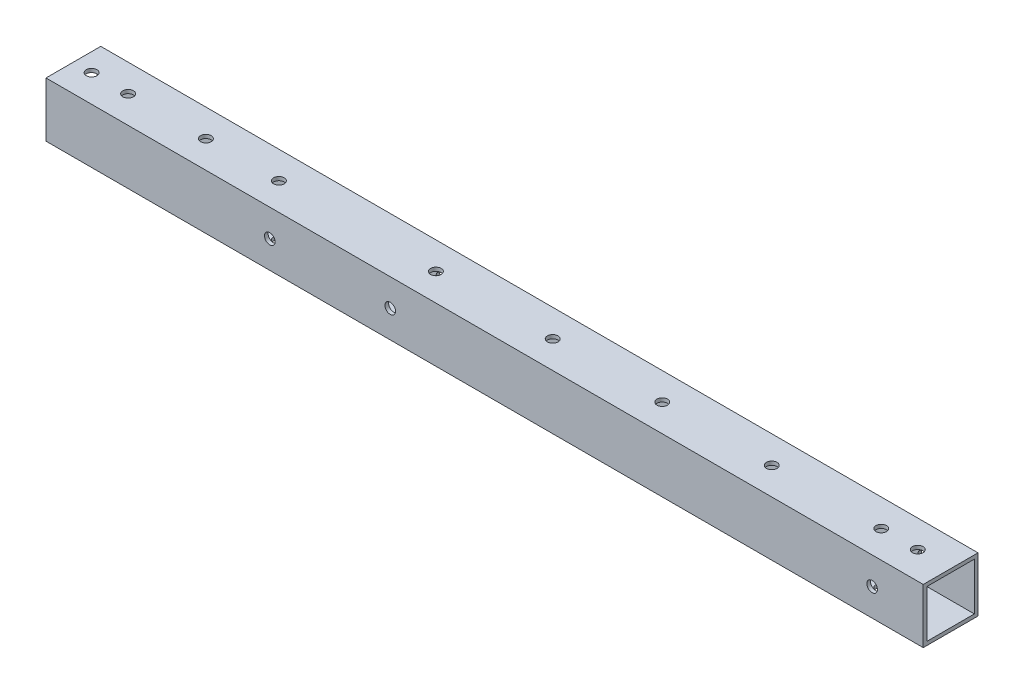
ISO-10303-21;
HEADER;
FILE_DESCRIPTION(('STEP AP214'),'2;1');
FILE_NAME('part.step','',(''),(''),'','','');
FILE_SCHEMA(('AUTOMOTIVE_DESIGN { 1 0 10303 214 1 1 1 1 }'));
ENDSEC;
DATA;
#1=APPLICATION_CONTEXT('core data for automotive mechanical design processes');
#2=APPLICATION_PROTOCOL_DEFINITION('international standard','automotive_design',2000,#1);
#3=PRODUCT_CONTEXT('',#1,'mechanical');
#4=PRODUCT('Part','Part','',(#3));
#5=PRODUCT_RELATED_PRODUCT_CATEGORY('part','',(#4));
#6=PRODUCT_DEFINITION_FORMATION('','',#4);
#7=PRODUCT_DEFINITION_CONTEXT('part definition',#1,'design');
#8=PRODUCT_DEFINITION('design','',#6,#7);
#9=PRODUCT_DEFINITION_SHAPE('','',#8);
#10=(LENGTH_UNIT() NAMED_UNIT(*) SI_UNIT(.MILLI.,.METRE.));
#11=(NAMED_UNIT(*) PLANE_ANGLE_UNIT() SI_UNIT($,.RADIAN.));
#12=(NAMED_UNIT(*) SI_UNIT($,.STERADIAN.) SOLID_ANGLE_UNIT());
#13=UNCERTAINTY_MEASURE_WITH_UNIT(LENGTH_MEASURE(1.E-05),#10,'distance_accuracy_value','');
#14=(GEOMETRIC_REPRESENTATION_CONTEXT(3) GLOBAL_UNCERTAINTY_ASSIGNED_CONTEXT((#13)) GLOBAL_UNIT_ASSIGNED_CONTEXT((#10,
#11,#12)) REPRESENTATION_CONTEXT('',''));
#15=CARTESIAN_POINT('',(0.,0.,0.));
#16=DIRECTION('',(0.,0.,1.));
#17=DIRECTION('',(1.,0.,0.));
#18=AXIS2_PLACEMENT_3D('',#15,#16,#17);
#19=CARTESIAN_POINT('',(240.3,0.,0.));
#20=DIRECTION('',(-1.,0.,0.));
#21=DIRECTION('',(0.,0.,1.));
#22=AXIS2_PLACEMENT_3D('',#19,#20,#21);
#23=PLANE('',#22);
#24=DIRECTION('',(0.,1.,0.));
#25=VECTOR('',#24,1.);
#26=CARTESIAN_POINT('',(240.3,-7.5,-7.5));
#27=LINE('',#26,#25);
#28=CARTESIAN_POINT('',(240.3,-7.5,-7.5));
#29=VERTEX_POINT('',#28);
#30=CARTESIAN_POINT('',(240.3,7.5,-7.5));
#31=VERTEX_POINT('',#30);
#32=EDGE_CURVE('E164',#29,#31,#27,.T.);
#33=ORIENTED_EDGE('',*,*,#32,.T.);
#34=DIRECTION('',(0.,0.,1.));
#35=VECTOR('',#34,1.);
#36=CARTESIAN_POINT('',(240.3,7.5,7.5));
#37=LINE('',#36,#35);
#38=CARTESIAN_POINT('',(240.3,7.5,7.5));
#39=VERTEX_POINT('',#38);
#40=EDGE_CURVE('E168',#31,#39,#37,.T.);
#41=ORIENTED_EDGE('',*,*,#40,.T.);
#42=DIRECTION('',(0.,-1.,0.));
#43=VECTOR('',#42,1.);
#44=CARTESIAN_POINT('',(240.3,-7.5,7.5));
#45=LINE('',#44,#43);
#46=CARTESIAN_POINT('',(240.3,-7.5,7.5));
#47=VERTEX_POINT('',#46);
#48=EDGE_CURVE('E172',#39,#47,#45,.T.);
#49=ORIENTED_EDGE('',*,*,#48,.T.);
#50=DIRECTION('',(0.,0.,-1.));
#51=VECTOR('',#50,1.);
#52=CARTESIAN_POINT('',(240.3,-7.5,7.5));
#53=LINE('',#52,#51);
#54=EDGE_CURVE('E175',#47,#29,#53,.T.);
#55=ORIENTED_EDGE('',*,*,#54,.T.);
#56=EDGE_LOOP('',(#33,#41,#49,#55));
#57=FACE_BOUND('',#56,.T.);
#58=DIRECTION('',(0.,0.,-1.));
#59=VECTOR('',#58,1.);
#60=CARTESIAN_POINT('',(240.3,-6.5,6.5));
#61=LINE('',#60,#59);
#62=CARTESIAN_POINT('',(240.3,-6.5,6.5));
#63=VERTEX_POINT('',#62);
#64=CARTESIAN_POINT('',(240.3,-6.5,-6.5));
#65=VERTEX_POINT('',#64);
#66=EDGE_CURVE('E112',#63,#65,#61,.T.);
#67=ORIENTED_EDGE('',*,*,#66,.F.);
#68=DIRECTION('',(0.,-1.,0.));
#69=VECTOR('',#68,1.);
#70=CARTESIAN_POINT('',(240.3,-6.5,6.5));
#71=LINE('',#70,#69);
#72=CARTESIAN_POINT('',(240.3,6.5,6.5));
#73=VERTEX_POINT('',#72);
#74=EDGE_CURVE('E140',#73,#63,#71,.T.);
#75=ORIENTED_EDGE('',*,*,#74,.F.);
#76=DIRECTION('',(0.,0.,1.));
#77=VECTOR('',#76,1.);
#78=CARTESIAN_POINT('',(240.3,6.5,6.5));
#79=LINE('',#78,#77);
#80=CARTESIAN_POINT('',(240.3,6.5,-6.5));
#81=VERTEX_POINT('',#80);
#82=EDGE_CURVE('E134',#81,#73,#79,.T.);
#83=ORIENTED_EDGE('',*,*,#82,.F.);
#84=DIRECTION('',(0.,1.,0.));
#85=VECTOR('',#84,1.);
#86=CARTESIAN_POINT('',(240.3,-6.5,-6.5));
#87=LINE('',#86,#85);
#88=EDGE_CURVE('E121',#65,#81,#87,.T.);
#89=ORIENTED_EDGE('',*,*,#88,.F.);
#90=EDGE_LOOP('',(#67,#75,#83,#89));
#91=FACE_BOUND('',#90,.T.);
#92=ADVANCED_FACE('F44',(#57,#91),#23,.F.);
#93=CARTESIAN_POINT('',(0.,0.,0.));
#94=DIRECTION('',(-1.,0.,0.));
#95=DIRECTION('',(0.,0.,1.));
#96=AXIS2_PLACEMENT_3D('',#93,#94,#95);
#97=PLANE('',#96);
#98=DIRECTION('',(0.,1.,0.));
#99=VECTOR('',#98,1.);
#100=CARTESIAN_POINT('',(0.,-7.5,-7.5));
#101=LINE('',#100,#99);
#102=CARTESIAN_POINT('',(0.,-7.5,-7.5));
#103=VERTEX_POINT('',#102);
#104=CARTESIAN_POINT('',(0.,7.5,-7.5));
#105=VERTEX_POINT('',#104);
#106=EDGE_CURVE('E130',#103,#105,#101,.T.);
#107=ORIENTED_EDGE('',*,*,#106,.F.);
#108=DIRECTION('',(0.,0.,-1.));
#109=VECTOR('',#108,1.);
#110=CARTESIAN_POINT('',(0.,-7.5,7.5));
#111=LINE('',#110,#109);
#112=CARTESIAN_POINT('',(0.,-7.5,7.5));
#113=VERTEX_POINT('',#112);
#114=EDGE_CURVE('E169',#113,#103,#111,.T.);
#115=ORIENTED_EDGE('',*,*,#114,.F.);
#116=DIRECTION('',(0.,-1.,0.));
#117=VECTOR('',#116,1.);
#118=CARTESIAN_POINT('',(0.,-7.5,7.5));
#119=LINE('',#118,#117);
#120=CARTESIAN_POINT('',(0.,7.5,7.5));
#121=VERTEX_POINT('',#120);
#122=EDGE_CURVE('E185',#121,#113,#119,.T.);
#123=ORIENTED_EDGE('',*,*,#122,.F.);
#124=DIRECTION('',(0.,0.,1.));
#125=VECTOR('',#124,1.);
#126=CARTESIAN_POINT('',(0.,7.5,7.5));
#127=LINE('',#126,#125);
#128=EDGE_CURVE('E182',#105,#121,#127,.T.);
#129=ORIENTED_EDGE('',*,*,#128,.F.);
#130=EDGE_LOOP('',(#107,#115,#123,#129));
#131=FACE_BOUND('',#130,.T.);
#132=DIRECTION('',(0.,-1.,0.));
#133=VECTOR('',#132,1.);
#134=CARTESIAN_POINT('',(0.,-6.5,6.5));
#135=LINE('',#134,#133);
#136=CARTESIAN_POINT('',(0.,6.5,6.5));
#137=VERTEX_POINT('',#136);
#138=CARTESIAN_POINT('',(0.,-6.5,6.5));
#139=VERTEX_POINT('',#138);
#140=EDGE_CURVE('E122',#137,#139,#135,.T.);
#141=ORIENTED_EDGE('',*,*,#140,.T.);
#142=DIRECTION('',(0.,0.,-1.));
#143=VECTOR('',#142,1.);
#144=CARTESIAN_POINT('',(0.,-6.5,6.5));
#145=LINE('',#144,#143);
#146=CARTESIAN_POINT('',(0.,-6.5,-6.5));
#147=VERTEX_POINT('',#146);
#148=EDGE_CURVE('E70',#139,#147,#145,.T.);
#149=ORIENTED_EDGE('',*,*,#148,.T.);
#150=DIRECTION('',(0.,1.,0.));
#151=VECTOR('',#150,1.);
#152=CARTESIAN_POINT('',(0.,-6.5,-6.5));
#153=LINE('',#152,#151);
#154=CARTESIAN_POINT('',(0.,6.5,-6.5));
#155=VERTEX_POINT('',#154);
#156=EDGE_CURVE('E128',#147,#155,#153,.T.);
#157=ORIENTED_EDGE('',*,*,#156,.T.);
#158=DIRECTION('',(0.,0.,1.));
#159=VECTOR('',#158,1.);
#160=CARTESIAN_POINT('',(0.,6.5,6.5));
#161=LINE('',#160,#159);
#162=EDGE_CURVE('E151',#155,#137,#161,.T.);
#163=ORIENTED_EDGE('',*,*,#162,.T.);
#164=EDGE_LOOP('',(#141,#149,#157,#163));
#165=FACE_BOUND('',#164,.T.);
#166=ADVANCED_FACE('F434',(#131,#165),#97,.T.);
#167=CARTESIAN_POINT('',(240.3,-7.5,-7.5));
#168=DIRECTION('',(0.,0.,1.));
#169=DIRECTION('',(1.,0.,0.));
#170=AXIS2_PLACEMENT_3D('',#167,#168,#169);
#171=PLANE('',#170);
#172=CARTESIAN_POINT('',(61.3015151901319,0.,-7.5));
#173=DIRECTION('',(0.,0.,1.));
#174=DIRECTION('',(1.,0.,0.));
#175=AXIS2_PLACEMENT_3D('',#172,#173,#174);
#176=CIRCLE('',#175,1.45);
#177=CARTESIAN_POINT('',(62.7515151901319,0.,-7.5));
#178=VERTEX_POINT('',#177);
#179=EDGE_CURVE('E253',#178,#178,#176,.T.);
#180=ORIENTED_EDGE('',*,*,#179,.T.);
#181=EDGE_LOOP('',(#180));
#182=FACE_BOUND('',#181,.T.);
#183=CARTESIAN_POINT('',(226.301515190132,0.,-7.5));
#184=DIRECTION('',(0.,0.,1.));
#185=DIRECTION('',(1.,0.,0.));
#186=AXIS2_PLACEMENT_3D('',#183,#184,#185);
#187=CIRCLE('',#186,1.45);
#188=CARTESIAN_POINT('',(227.751515190132,0.,-7.5));
#189=VERTEX_POINT('',#188);
#190=EDGE_CURVE('E548',#189,#189,#187,.T.);
#191=ORIENTED_EDGE('',*,*,#190,.T.);
#192=EDGE_LOOP('',(#191));
#193=FACE_BOUND('',#192,.T.);
#194=CARTESIAN_POINT('',(94.3015151901319,0.,-7.5));
#195=DIRECTION('',(0.,0.,1.));
#196=DIRECTION('',(1.,0.,0.));
#197=AXIS2_PLACEMENT_3D('',#194,#195,#196);
#198=CIRCLE('',#197,1.45);
#199=CARTESIAN_POINT('',(95.751515190132,0.,-7.5));
#200=VERTEX_POINT('',#199);
#201=EDGE_CURVE('E270',#200,#200,#198,.T.);
#202=ORIENTED_EDGE('',*,*,#201,.T.);
#203=EDGE_LOOP('',(#202));
#204=FACE_BOUND('',#203,.T.);
#205=ORIENTED_EDGE('',*,*,#106,.T.);
#206=DIRECTION('',(-1.,0.,0.));
#207=VECTOR('',#206,1.);
#208=CARTESIAN_POINT('',(240.3,7.5,-7.5));
#209=LINE('',#208,#207);
#210=EDGE_CURVE('E11',#31,#105,#209,.T.);
#211=ORIENTED_EDGE('',*,*,#210,.F.);
#212=ORIENTED_EDGE('',*,*,#32,.F.);
#213=DIRECTION('',(-1.,0.,0.));
#214=VECTOR('',#213,1.);
#215=CARTESIAN_POINT('',(240.3,-7.5,-7.5));
#216=LINE('',#215,#214);
#217=EDGE_CURVE('E178',#29,#103,#216,.T.);
#218=ORIENTED_EDGE('',*,*,#217,.T.);
#219=EDGE_LOOP('',(#205,#211,#212,#218));
#220=FACE_BOUND('',#219,.T.);
#221=ADVANCED_FACE('F46',(#182,#193,#204,#220),#171,.F.);
#222=CARTESIAN_POINT('',(240.3,7.5,7.5));
#223=DIRECTION('',(0.,-1.,0.));
#224=DIRECTION('',(0.,0.,-1.));
#225=AXIS2_PLACEMENT_3D('',#222,#223,#224);
#226=PLANE('',#225);
#227=CARTESIAN_POINT('',(5.00000000000001,7.5,0.));
#228=DIRECTION('',(0.,1.,0.));
#229=DIRECTION('',(0.,0.,1.));
#230=AXIS2_PLACEMENT_3D('',#227,#228,#229);
#231=CIRCLE('',#230,1.45);
#232=CARTESIAN_POINT('',(5.00000000000001,7.5,1.44999999999999));
#233=VERTEX_POINT('',#232);
#234=EDGE_CURVE('E281',#233,#233,#231,.T.);
#235=ORIENTED_EDGE('',*,*,#234,.F.);
#236=EDGE_LOOP('',(#235));
#237=FACE_BOUND('',#236,.T.);
#238=CARTESIAN_POINT('',(191.301515190132,7.5,0.));
#239=DIRECTION('',(0.,1.,0.));
#240=DIRECTION('',(0.,0.,1.));
#241=AXIS2_PLACEMENT_3D('',#238,#239,#240);
#242=CIRCLE('',#241,1.45);
#243=CARTESIAN_POINT('',(191.301515190132,7.5,1.45));
#244=VERTEX_POINT('',#243);
#245=EDGE_CURVE('E286',#244,#244,#242,.T.);
#246=ORIENTED_EDGE('',*,*,#245,.F.);
#247=EDGE_LOOP('',(#246));
#248=FACE_BOUND('',#247,.T.);
#249=CARTESIAN_POINT('',(161.301515190132,7.5,0.));
#250=DIRECTION('',(0.,1.,0.));
#251=DIRECTION('',(0.,0.,1.));
#252=AXIS2_PLACEMENT_3D('',#249,#250,#251);
#253=CIRCLE('',#252,1.45);
#254=CARTESIAN_POINT('',(161.301515190132,7.5,1.45));
#255=VERTEX_POINT('',#254);
#256=EDGE_CURVE('E349',#255,#255,#253,.T.);
#257=ORIENTED_EDGE('',*,*,#256,.F.);
#258=EDGE_LOOP('',(#257));
#259=FACE_BOUND('',#258,.T.);
#260=CARTESIAN_POINT('',(131.301515190132,7.5,0.));
#261=DIRECTION('',(0.,1.,0.));
#262=DIRECTION('',(0.,0.,1.));
#263=AXIS2_PLACEMENT_3D('',#260,#261,#262);
#264=CIRCLE('',#263,1.45);
#265=CARTESIAN_POINT('',(131.301515190132,7.5,1.45));
#266=VERTEX_POINT('',#265);
#267=EDGE_CURVE('E341',#266,#266,#264,.T.);
#268=ORIENTED_EDGE('',*,*,#267,.F.);
#269=EDGE_LOOP('',(#268));
#270=FACE_BOUND('',#269,.T.);
#271=CARTESIAN_POINT('',(231.301515190132,7.5,0.));
#272=DIRECTION('',(0.,1.,0.));
#273=DIRECTION('',(0.,0.,1.));
#274=AXIS2_PLACEMENT_3D('',#271,#272,#273);
#275=CIRCLE('',#274,1.45);
#276=CARTESIAN_POINT('',(231.301515190132,7.5,1.45000000000001));
#277=VERTEX_POINT('',#276);
#278=EDGE_CURVE('E333',#277,#277,#275,.T.);
#279=ORIENTED_EDGE('',*,*,#278,.F.);
#280=EDGE_LOOP('',(#279));
#281=FACE_BOUND('',#280,.T.);
#282=CARTESIAN_POINT('',(221.301515190132,7.5,0.));
#283=DIRECTION('',(0.,1.,0.));
#284=DIRECTION('',(0.,0.,1.));
#285=AXIS2_PLACEMENT_3D('',#282,#283,#284);
#286=CIRCLE('',#285,1.45);
#287=CARTESIAN_POINT('',(221.301515190132,7.5,1.45000000000001));
#288=VERTEX_POINT('',#287);
#289=EDGE_CURVE('E325',#288,#288,#286,.T.);
#290=ORIENTED_EDGE('',*,*,#289,.F.);
#291=EDGE_LOOP('',(#290));
#292=FACE_BOUND('',#291,.T.);
#293=CARTESIAN_POINT('',(99.301515190132,7.5,0.));
#294=DIRECTION('',(0.,1.,0.));
#295=DIRECTION('',(0.,0.,1.));
#296=AXIS2_PLACEMENT_3D('',#293,#294,#295);
#297=CIRCLE('',#296,1.45);
#298=CARTESIAN_POINT('',(99.301515190132,7.5,1.44999999999999));
#299=VERTEX_POINT('',#298);
#300=EDGE_CURVE('E317',#299,#299,#297,.T.);
#301=ORIENTED_EDGE('',*,*,#300,.F.);
#302=EDGE_LOOP('',(#301));
#303=FACE_BOUND('',#302,.T.);
#304=CARTESIAN_POINT('',(56.301515190132,7.5,0.));
#305=DIRECTION('',(0.,1.,0.));
#306=DIRECTION('',(0.,0.,1.));
#307=AXIS2_PLACEMENT_3D('',#304,#305,#306);
#308=CIRCLE('',#307,1.45);
#309=CARTESIAN_POINT('',(56.301515190132,7.5,1.45000000000001));
#310=VERTEX_POINT('',#309);
#311=EDGE_CURVE('E309',#310,#310,#308,.T.);
#312=ORIENTED_EDGE('',*,*,#311,.F.);
#313=EDGE_LOOP('',(#312));
#314=FACE_BOUND('',#313,.T.);
#315=CARTESIAN_POINT('',(36.3015151901319,7.5,0.));
#316=DIRECTION('',(0.,1.,0.));
#317=DIRECTION('',(0.,0.,1.));
#318=AXIS2_PLACEMENT_3D('',#315,#316,#317);
#319=CIRCLE('',#318,1.45000000000001);
#320=CARTESIAN_POINT('',(36.3015151901319,7.5,1.45000000000003));
#321=VERTEX_POINT('',#320);
#322=EDGE_CURVE('E301',#321,#321,#319,.T.);
#323=ORIENTED_EDGE('',*,*,#322,.F.);
#324=EDGE_LOOP('',(#323));
#325=FACE_BOUND('',#324,.T.);
#326=CARTESIAN_POINT('',(15.,7.5,0.));
#327=DIRECTION('',(0.,1.,0.));
#328=DIRECTION('',(0.,0.,1.));
#329=AXIS2_PLACEMENT_3D('',#326,#327,#328);
#330=CIRCLE('',#329,1.45);
#331=CARTESIAN_POINT('',(15.,7.5,1.45));
#332=VERTEX_POINT('',#331);
#333=EDGE_CURVE('E285',#332,#332,#330,.T.);
#334=ORIENTED_EDGE('',*,*,#333,.F.);
#335=EDGE_LOOP('',(#334));
#336=FACE_BOUND('',#335,.T.);
#337=ORIENTED_EDGE('',*,*,#128,.T.);
#338=DIRECTION('',(-1.,0.,0.));
#339=VECTOR('',#338,1.);
#340=CARTESIAN_POINT('',(240.3,7.5,7.5));
#341=LINE('',#340,#339);
#342=EDGE_CURVE('E54',#39,#121,#341,.T.);
#343=ORIENTED_EDGE('',*,*,#342,.F.);
#344=ORIENTED_EDGE('',*,*,#40,.F.);
#345=ORIENTED_EDGE('',*,*,#210,.T.);
#346=EDGE_LOOP('',(#337,#343,#344,#345));
#347=FACE_BOUND('',#346,.T.);
#348=ADVANCED_FACE('F438',(#237,#248,#259,#270,#281,#292,#303,#314,#325,#336,#347),#226,.F.);
#349=CARTESIAN_POINT('',(240.3,-7.5,7.5));
#350=DIRECTION('',(0.,0.,-1.));
#351=DIRECTION('',(-1.,0.,0.));
#352=AXIS2_PLACEMENT_3D('',#349,#350,#351);
#353=PLANE('',#352);
#354=CARTESIAN_POINT('',(61.3015151901319,0.,7.5));
#355=DIRECTION('',(0.,0.,1.));
#356=DIRECTION('',(1.,0.,0.));
#357=AXIS2_PLACEMENT_3D('',#354,#355,#356);
#358=CIRCLE('',#357,1.45);
#359=CARTESIAN_POINT('',(62.7515151901319,0.,7.5));
#360=VERTEX_POINT('',#359);
#361=EDGE_CURVE('E539',#360,#360,#358,.T.);
#362=ORIENTED_EDGE('',*,*,#361,.F.);
#363=EDGE_LOOP('',(#362));
#364=FACE_BOUND('',#363,.T.);
#365=CARTESIAN_POINT('',(226.301515190132,0.,7.5));
#366=DIRECTION('',(0.,0.,1.));
#367=DIRECTION('',(1.,0.,0.));
#368=AXIS2_PLACEMENT_3D('',#365,#366,#367);
#369=CIRCLE('',#368,1.45);
#370=CARTESIAN_POINT('',(227.751515190132,0.,7.5));
#371=VERTEX_POINT('',#370);
#372=EDGE_CURVE('E543',#371,#371,#369,.T.);
#373=ORIENTED_EDGE('',*,*,#372,.F.);
#374=EDGE_LOOP('',(#373));
#375=FACE_BOUND('',#374,.T.);
#376=CARTESIAN_POINT('',(94.3015151901319,0.,7.5));
#377=DIRECTION('',(0.,0.,1.));
#378=DIRECTION('',(1.,0.,0.));
#379=AXIS2_PLACEMENT_3D('',#376,#377,#378);
#380=CIRCLE('',#379,1.45);
#381=CARTESIAN_POINT('',(95.751515190132,0.,7.5));
#382=VERTEX_POINT('',#381);
#383=EDGE_CURVE('E551',#382,#382,#380,.T.);
#384=ORIENTED_EDGE('',*,*,#383,.F.);
#385=EDGE_LOOP('',(#384));
#386=FACE_BOUND('',#385,.T.);
#387=ORIENTED_EDGE('',*,*,#122,.T.);
#388=DIRECTION('',(-1.,0.,0.));
#389=VECTOR('',#388,1.);
#390=CARTESIAN_POINT('',(240.3,-7.5,7.5));
#391=LINE('',#390,#389);
#392=EDGE_CURVE('E193',#47,#113,#391,.T.);
#393=ORIENTED_EDGE('',*,*,#392,.F.);
#394=ORIENTED_EDGE('',*,*,#48,.F.);
#395=ORIENTED_EDGE('',*,*,#342,.T.);
#396=EDGE_LOOP('',(#387,#393,#394,#395));
#397=FACE_BOUND('',#396,.T.);
#398=ADVANCED_FACE('F421',(#364,#375,#386,#397),#353,.F.);
#399=CARTESIAN_POINT('',(240.3,-7.5,7.5));
#400=DIRECTION('',(0.,1.,0.));
#401=DIRECTION('',(0.,0.,1.));
#402=AXIS2_PLACEMENT_3D('',#399,#400,#401);
#403=PLANE('',#402);
#404=CARTESIAN_POINT('',(5.00000000000001,-7.5,0.));
#405=DIRECTION('',(0.,1.,0.));
#406=DIRECTION('',(0.,0.,1.));
#407=AXIS2_PLACEMENT_3D('',#404,#405,#406);
#408=CIRCLE('',#407,1.45);
#409=CARTESIAN_POINT('',(5.00000000000001,-7.5,1.44999999999999));
#410=VERTEX_POINT('',#409);
#411=EDGE_CURVE('E205',#410,#410,#408,.T.);
#412=ORIENTED_EDGE('',*,*,#411,.T.);
#413=EDGE_LOOP('',(#412));
#414=FACE_BOUND('',#413,.T.);
#415=CARTESIAN_POINT('',(191.301515190132,-7.5,0.));
#416=DIRECTION('',(0.,1.,0.));
#417=DIRECTION('',(0.,0.,1.));
#418=AXIS2_PLACEMENT_3D('',#415,#416,#417);
#419=CIRCLE('',#418,1.45);
#420=CARTESIAN_POINT('',(191.301515190132,-7.5,1.45));
#421=VERTEX_POINT('',#420);
#422=EDGE_CURVE('E277',#421,#421,#419,.T.);
#423=ORIENTED_EDGE('',*,*,#422,.T.);
#424=EDGE_LOOP('',(#423));
#425=FACE_BOUND('',#424,.T.);
#426=CARTESIAN_POINT('',(161.301515190132,-7.5,0.));
#427=DIRECTION('',(0.,1.,0.));
#428=DIRECTION('',(0.,0.,1.));
#429=AXIS2_PLACEMENT_3D('',#426,#427,#428);
#430=CIRCLE('',#429,1.45);
#431=CARTESIAN_POINT('',(161.301515190132,-7.5,1.45));
#432=VERTEX_POINT('',#431);
#433=EDGE_CURVE('E290',#432,#432,#430,.T.);
#434=ORIENTED_EDGE('',*,*,#433,.T.);
#435=EDGE_LOOP('',(#434));
#436=FACE_BOUND('',#435,.T.);
#437=CARTESIAN_POINT('',(131.301515190132,-7.5,0.));
#438=DIRECTION('',(0.,1.,0.));
#439=DIRECTION('',(0.,0.,1.));
#440=AXIS2_PLACEMENT_3D('',#437,#438,#439);
#441=CIRCLE('',#440,1.45);
#442=CARTESIAN_POINT('',(131.301515190132,-7.5,1.45));
#443=VERTEX_POINT('',#442);
#444=EDGE_CURVE('E345',#443,#443,#441,.T.);
#445=ORIENTED_EDGE('',*,*,#444,.T.);
#446=EDGE_LOOP('',(#445));
#447=FACE_BOUND('',#446,.T.);
#448=CARTESIAN_POINT('',(231.301515190132,-7.5,0.));
#449=DIRECTION('',(0.,1.,0.));
#450=DIRECTION('',(0.,0.,1.));
#451=AXIS2_PLACEMENT_3D('',#448,#449,#450);
#452=CIRCLE('',#451,1.45);
#453=CARTESIAN_POINT('',(231.301515190132,-7.5,1.45000000000001));
#454=VERTEX_POINT('',#453);
#455=EDGE_CURVE('E337',#454,#454,#452,.T.);
#456=ORIENTED_EDGE('',*,*,#455,.T.);
#457=EDGE_LOOP('',(#456));
#458=FACE_BOUND('',#457,.T.);
#459=CARTESIAN_POINT('',(221.301515190132,-7.5,0.));
#460=DIRECTION('',(0.,1.,0.));
#461=DIRECTION('',(0.,0.,1.));
#462=AXIS2_PLACEMENT_3D('',#459,#460,#461);
#463=CIRCLE('',#462,1.45);
#464=CARTESIAN_POINT('',(221.301515190132,-7.5,1.45000000000001));
#465=VERTEX_POINT('',#464);
#466=EDGE_CURVE('E329',#465,#465,#463,.T.);
#467=ORIENTED_EDGE('',*,*,#466,.T.);
#468=EDGE_LOOP('',(#467));
#469=FACE_BOUND('',#468,.T.);
#470=CARTESIAN_POINT('',(99.301515190132,-7.5,0.));
#471=DIRECTION('',(0.,1.,0.));
#472=DIRECTION('',(0.,0.,1.));
#473=AXIS2_PLACEMENT_3D('',#470,#471,#472);
#474=CIRCLE('',#473,1.45);
#475=CARTESIAN_POINT('',(99.301515190132,-7.5,1.44999999999999));
#476=VERTEX_POINT('',#475);
#477=EDGE_CURVE('E321',#476,#476,#474,.T.);
#478=ORIENTED_EDGE('',*,*,#477,.T.);
#479=EDGE_LOOP('',(#478));
#480=FACE_BOUND('',#479,.T.);
#481=CARTESIAN_POINT('',(56.301515190132,-7.5,0.));
#482=DIRECTION('',(0.,1.,0.));
#483=DIRECTION('',(0.,0.,1.));
#484=AXIS2_PLACEMENT_3D('',#481,#482,#483);
#485=CIRCLE('',#484,1.45);
#486=CARTESIAN_POINT('',(56.301515190132,-7.5,1.45000000000001));
#487=VERTEX_POINT('',#486);
#488=EDGE_CURVE('E313',#487,#487,#485,.T.);
#489=ORIENTED_EDGE('',*,*,#488,.T.);
#490=EDGE_LOOP('',(#489));
#491=FACE_BOUND('',#490,.T.);
#492=CARTESIAN_POINT('',(36.3015151901319,-7.5,0.));
#493=DIRECTION('',(0.,1.,0.));
#494=DIRECTION('',(0.,0.,1.));
#495=AXIS2_PLACEMENT_3D('',#492,#493,#494);
#496=CIRCLE('',#495,1.45000000000001);
#497=CARTESIAN_POINT('',(36.3015151901319,-7.5,1.45000000000003));
#498=VERTEX_POINT('',#497);
#499=EDGE_CURVE('E305',#498,#498,#496,.T.);
#500=ORIENTED_EDGE('',*,*,#499,.T.);
#501=EDGE_LOOP('',(#500));
#502=FACE_BOUND('',#501,.T.);
#503=CARTESIAN_POINT('',(15.,-7.5,0.));
#504=DIRECTION('',(0.,1.,0.));
#505=DIRECTION('',(0.,0.,1.));
#506=AXIS2_PLACEMENT_3D('',#503,#504,#505);
#507=CIRCLE('',#506,1.45);
#508=CARTESIAN_POINT('',(15.,-7.5,1.45));
#509=VERTEX_POINT('',#508);
#510=EDGE_CURVE('E297',#509,#509,#507,.T.);
#511=ORIENTED_EDGE('',*,*,#510,.T.);
#512=EDGE_LOOP('',(#511));
#513=FACE_BOUND('',#512,.T.);
#514=ORIENTED_EDGE('',*,*,#114,.T.);
#515=ORIENTED_EDGE('',*,*,#217,.F.);
#516=ORIENTED_EDGE('',*,*,#54,.F.);
#517=ORIENTED_EDGE('',*,*,#392,.T.);
#518=EDGE_LOOP('',(#514,#515,#516,#517));
#519=FACE_BOUND('',#518,.T.);
#520=ADVANCED_FACE('F390',(#414,#425,#436,#447,#458,#469,#480,#491,#502,#513,#519),#403,.F.);
#521=CARTESIAN_POINT('',(240.3,-6.5,6.5));
#522=DIRECTION('',(0.,1.,0.));
#523=DIRECTION('',(0.,0.,1.));
#524=AXIS2_PLACEMENT_3D('',#521,#522,#523);
#525=PLANE('',#524);
#526=CARTESIAN_POINT('',(5.00000000000001,-6.5,0.));
#527=DIRECTION('',(0.,1.,0.));
#528=DIRECTION('',(0.,0.,1.));
#529=AXIS2_PLACEMENT_3D('',#526,#527,#528);
#530=CIRCLE('',#529,1.45);
#531=CARTESIAN_POINT('',(5.00000000000001,-6.5,1.44999999999999));
#532=VERTEX_POINT('',#531);
#533=EDGE_CURVE('E148',#532,#532,#530,.T.);
#534=ORIENTED_EDGE('',*,*,#533,.F.);
#535=EDGE_LOOP('',(#534));
#536=FACE_BOUND('',#535,.T.);
#537=CARTESIAN_POINT('',(191.301515190132,-6.5,0.));
#538=DIRECTION('',(0.,1.,0.));
#539=DIRECTION('',(0.,0.,1.));
#540=AXIS2_PLACEMENT_3D('',#537,#538,#539);
#541=CIRCLE('',#540,1.45);
#542=CARTESIAN_POINT('',(191.301515190132,-6.5,1.45));
#543=VERTEX_POINT('',#542);
#544=EDGE_CURVE('E245',#543,#543,#541,.T.);
#545=ORIENTED_EDGE('',*,*,#544,.F.);
#546=EDGE_LOOP('',(#545));
#547=FACE_BOUND('',#546,.T.);
#548=CARTESIAN_POINT('',(161.301515190132,-6.5,0.));
#549=DIRECTION('',(0.,1.,0.));
#550=DIRECTION('',(0.,0.,1.));
#551=AXIS2_PLACEMENT_3D('',#548,#549,#550);
#552=CIRCLE('',#551,1.45);
#553=CARTESIAN_POINT('',(161.301515190132,-6.5,1.45));
#554=VERTEX_POINT('',#553);
#555=EDGE_CURVE('E240',#554,#554,#552,.T.);
#556=ORIENTED_EDGE('',*,*,#555,.F.);
#557=EDGE_LOOP('',(#556));
#558=FACE_BOUND('',#557,.T.);
#559=CARTESIAN_POINT('',(131.301515190132,-6.5,0.));
#560=DIRECTION('',(0.,1.,0.));
#561=DIRECTION('',(0.,0.,1.));
#562=AXIS2_PLACEMENT_3D('',#559,#560,#561);
#563=CIRCLE('',#562,1.45);
#564=CARTESIAN_POINT('',(131.301515190132,-6.5,1.45));
#565=VERTEX_POINT('',#564);
#566=EDGE_CURVE('E235',#565,#565,#563,.T.);
#567=ORIENTED_EDGE('',*,*,#566,.F.);
#568=EDGE_LOOP('',(#567));
#569=FACE_BOUND('',#568,.T.);
#570=CARTESIAN_POINT('',(231.301515190132,-6.5,0.));
#571=DIRECTION('',(0.,1.,0.));
#572=DIRECTION('',(0.,0.,1.));
#573=AXIS2_PLACEMENT_3D('',#570,#571,#572);
#574=CIRCLE('',#573,1.45);
#575=CARTESIAN_POINT('',(231.301515190132,-6.5,1.45000000000001));
#576=VERTEX_POINT('',#575);
#577=EDGE_CURVE('E230',#576,#576,#574,.T.);
#578=ORIENTED_EDGE('',*,*,#577,.F.);
#579=EDGE_LOOP('',(#578));
#580=FACE_BOUND('',#579,.T.);
#581=CARTESIAN_POINT('',(221.301515190132,-6.5,0.));
#582=DIRECTION('',(0.,1.,0.));
#583=DIRECTION('',(0.,0.,1.));
#584=AXIS2_PLACEMENT_3D('',#581,#582,#583);
#585=CIRCLE('',#584,1.45);
#586=CARTESIAN_POINT('',(221.301515190132,-6.5,1.45000000000001));
#587=VERTEX_POINT('',#586);
#588=EDGE_CURVE('E225',#587,#587,#585,.T.);
#589=ORIENTED_EDGE('',*,*,#588,.F.);
#590=EDGE_LOOP('',(#589));
#591=FACE_BOUND('',#590,.T.);
#592=CARTESIAN_POINT('',(99.301515190132,-6.5,0.));
#593=DIRECTION('',(0.,1.,0.));
#594=DIRECTION('',(0.,0.,1.));
#595=AXIS2_PLACEMENT_3D('',#592,#593,#594);
#596=CIRCLE('',#595,1.45);
#597=CARTESIAN_POINT('',(99.301515190132,-6.5,1.44999999999999));
#598=VERTEX_POINT('',#597);
#599=EDGE_CURVE('E220',#598,#598,#596,.T.);
#600=ORIENTED_EDGE('',*,*,#599,.F.);
#601=EDGE_LOOP('',(#600));
#602=FACE_BOUND('',#601,.T.);
#603=CARTESIAN_POINT('',(56.301515190132,-6.5,0.));
#604=DIRECTION('',(0.,1.,0.));
#605=DIRECTION('',(0.,0.,1.));
#606=AXIS2_PLACEMENT_3D('',#603,#604,#605);
#607=CIRCLE('',#606,1.45);
#608=CARTESIAN_POINT('',(56.301515190132,-6.5,1.45000000000001));
#609=VERTEX_POINT('',#608);
#610=EDGE_CURVE('E215',#609,#609,#607,.T.);
#611=ORIENTED_EDGE('',*,*,#610,.F.);
#612=EDGE_LOOP('',(#611));
#613=FACE_BOUND('',#612,.T.);
#614=CARTESIAN_POINT('',(36.3015151901319,-6.5,0.));
#615=DIRECTION('',(0.,1.,0.));
#616=DIRECTION('',(0.,0.,1.));
#617=AXIS2_PLACEMENT_3D('',#614,#615,#616);
#618=CIRCLE('',#617,1.45000000000001);
#619=CARTESIAN_POINT('',(36.3015151901319,-6.5,1.45000000000003));
#620=VERTEX_POINT('',#619);
#621=EDGE_CURVE('E210',#620,#620,#618,.T.);
#622=ORIENTED_EDGE('',*,*,#621,.F.);
#623=EDGE_LOOP('',(#622));
#624=FACE_BOUND('',#623,.T.);
#625=CARTESIAN_POINT('',(15.,-6.5,0.));
#626=DIRECTION('',(0.,1.,0.));
#627=DIRECTION('',(0.,0.,1.));
#628=AXIS2_PLACEMENT_3D('',#625,#626,#627);
#629=CIRCLE('',#628,1.45);
#630=CARTESIAN_POINT('',(15.,-6.5,1.45));
#631=VERTEX_POINT('',#630);
#632=EDGE_CURVE('E204',#631,#631,#629,.T.);
#633=ORIENTED_EDGE('',*,*,#632,.F.);
#634=EDGE_LOOP('',(#633));
#635=FACE_BOUND('',#634,.T.);
#636=ORIENTED_EDGE('',*,*,#148,.F.);
#637=DIRECTION('',(-1.,0.,0.));
#638=VECTOR('',#637,1.);
#639=CARTESIAN_POINT('',(240.3,-6.5,6.5));
#640=LINE('',#639,#638);
#641=EDGE_CURVE('E116',#63,#139,#640,.T.);
#642=ORIENTED_EDGE('',*,*,#641,.F.);
#643=ORIENTED_EDGE('',*,*,#66,.T.);
#644=DIRECTION('',(-1.,0.,0.));
#645=VECTOR('',#644,1.);
#646=CARTESIAN_POINT('',(240.3,-6.5,-6.5));
#647=LINE('',#646,#645);
#648=EDGE_CURVE('E115',#65,#147,#647,.T.);
#649=ORIENTED_EDGE('',*,*,#648,.T.);
#650=EDGE_LOOP('',(#636,#642,#643,#649));
#651=FACE_BOUND('',#650,.T.);
#652=ADVANCED_FACE('F114',(#536,#547,#558,#569,#580,#591,#602,#613,#624,#635,#651),#525,.T.);
#653=CARTESIAN_POINT('',(240.3,-6.5,-6.5));
#654=DIRECTION('',(0.,0.,1.));
#655=DIRECTION('',(0.,-1.,0.));
#656=AXIS2_PLACEMENT_3D('',#653,#654,#655);
#657=PLANE('',#656);
#658=CARTESIAN_POINT('',(61.3015151901319,0.,-6.5));
#659=DIRECTION('',(0.,0.,1.));
#660=DIRECTION('',(0.,-1.,0.));
#661=AXIS2_PLACEMENT_3D('',#658,#659,#660);
#662=CIRCLE('',#661,1.45);
#663=CARTESIAN_POINT('',(61.3015151901319,-1.45000000000002,-6.5));
#664=VERTEX_POINT('',#663);
#665=EDGE_CURVE('E273',#664,#664,#662,.T.);
#666=ORIENTED_EDGE('',*,*,#665,.F.);
#667=EDGE_LOOP('',(#666));
#668=FACE_BOUND('',#667,.T.);
#669=CARTESIAN_POINT('',(226.301515190132,0.,-6.5));
#670=DIRECTION('',(0.,0.,1.));
#671=DIRECTION('',(0.,-1.,0.));
#672=AXIS2_PLACEMENT_3D('',#669,#670,#671);
#673=CIRCLE('',#672,1.45);
#674=CARTESIAN_POINT('',(226.301515190132,-1.45,-6.5));
#675=VERTEX_POINT('',#674);
#676=EDGE_CURVE('E257',#675,#675,#673,.T.);
#677=ORIENTED_EDGE('',*,*,#676,.F.);
#678=EDGE_LOOP('',(#677));
#679=FACE_BOUND('',#678,.T.);
#680=CARTESIAN_POINT('',(94.3015151901319,0.,-6.5));
#681=DIRECTION('',(0.,0.,1.));
#682=DIRECTION('',(0.,-1.,0.));
#683=AXIS2_PLACEMENT_3D('',#680,#681,#682);
#684=CIRCLE('',#683,1.45);
#685=CARTESIAN_POINT('',(94.3015151901319,-1.44999999999998,-6.5));
#686=VERTEX_POINT('',#685);
#687=EDGE_CURVE('E252',#686,#686,#684,.T.);
#688=ORIENTED_EDGE('',*,*,#687,.F.);
#689=EDGE_LOOP('',(#688));
#690=FACE_BOUND('',#689,.T.);
#691=ORIENTED_EDGE('',*,*,#156,.F.);
#692=ORIENTED_EDGE('',*,*,#648,.F.);
#693=ORIENTED_EDGE('',*,*,#88,.T.);
#694=DIRECTION('',(-1.,0.,0.));
#695=VECTOR('',#694,1.);
#696=CARTESIAN_POINT('',(240.3,6.5,-6.5));
#697=LINE('',#696,#695);
#698=EDGE_CURVE('E131',#81,#155,#697,.T.);
#699=ORIENTED_EDGE('',*,*,#698,.T.);
#700=EDGE_LOOP('',(#691,#692,#693,#699));
#701=FACE_BOUND('',#700,.T.);
#702=ADVANCED_FACE('F125',(#668,#679,#690,#701),#657,.T.);
#703=CARTESIAN_POINT('',(240.3,6.5,6.5));
#704=DIRECTION('',(0.,-1.,0.));
#705=DIRECTION('',(0.,0.,-1.));
#706=AXIS2_PLACEMENT_3D('',#703,#704,#705);
#707=PLANE('',#706);
#708=CARTESIAN_POINT('',(5.00000000000001,6.5,0.));
#709=DIRECTION('',(0.,-1.,0.));
#710=DIRECTION('',(0.,0.,-1.));
#711=AXIS2_PLACEMENT_3D('',#708,#709,#710);
#712=CIRCLE('',#711,1.45);
#713=CARTESIAN_POINT('',(5.00000000000001,6.5,-1.45000000000001));
#714=VERTEX_POINT('',#713);
#715=EDGE_CURVE('E246',#714,#714,#712,.T.);
#716=ORIENTED_EDGE('',*,*,#715,.F.);
#717=EDGE_LOOP('',(#716));
#718=FACE_BOUND('',#717,.T.);
#719=CARTESIAN_POINT('',(191.301515190132,6.5,0.));
#720=DIRECTION('',(0.,-1.,0.));
#721=DIRECTION('',(0.,0.,-1.));
#722=AXIS2_PLACEMENT_3D('',#719,#720,#721);
#723=CIRCLE('',#722,1.45);
#724=CARTESIAN_POINT('',(191.301515190132,6.5,-1.45));
#725=VERTEX_POINT('',#724);
#726=EDGE_CURVE('E241',#725,#725,#723,.T.);
#727=ORIENTED_EDGE('',*,*,#726,.F.);
#728=EDGE_LOOP('',(#727));
#729=FACE_BOUND('',#728,.T.);
#730=CARTESIAN_POINT('',(161.301515190132,6.5,0.));
#731=DIRECTION('',(0.,-1.,0.));
#732=DIRECTION('',(0.,0.,-1.));
#733=AXIS2_PLACEMENT_3D('',#730,#731,#732);
#734=CIRCLE('',#733,1.45);
#735=CARTESIAN_POINT('',(161.301515190132,6.5,-1.45));
#736=VERTEX_POINT('',#735);
#737=EDGE_CURVE('E236',#736,#736,#734,.T.);
#738=ORIENTED_EDGE('',*,*,#737,.F.);
#739=EDGE_LOOP('',(#738));
#740=FACE_BOUND('',#739,.T.);
#741=CARTESIAN_POINT('',(131.301515190132,6.5,0.));
#742=DIRECTION('',(0.,-1.,0.));
#743=DIRECTION('',(0.,0.,-1.));
#744=AXIS2_PLACEMENT_3D('',#741,#742,#743);
#745=CIRCLE('',#744,1.45);
#746=CARTESIAN_POINT('',(131.301515190132,6.5,-1.45));
#747=VERTEX_POINT('',#746);
#748=EDGE_CURVE('E231',#747,#747,#745,.T.);
#749=ORIENTED_EDGE('',*,*,#748,.F.);
#750=EDGE_LOOP('',(#749));
#751=FACE_BOUND('',#750,.T.);
#752=CARTESIAN_POINT('',(231.301515190132,6.5,0.));
#753=DIRECTION('',(0.,-1.,0.));
#754=DIRECTION('',(0.,0.,-1.));
#755=AXIS2_PLACEMENT_3D('',#752,#753,#754);
#756=CIRCLE('',#755,1.45);
#757=CARTESIAN_POINT('',(231.301515190132,6.5,-1.44999999999999));
#758=VERTEX_POINT('',#757);
#759=EDGE_CURVE('E226',#758,#758,#756,.T.);
#760=ORIENTED_EDGE('',*,*,#759,.F.);
#761=EDGE_LOOP('',(#760));
#762=FACE_BOUND('',#761,.T.);
#763=CARTESIAN_POINT('',(221.301515190132,6.5,0.));
#764=DIRECTION('',(0.,-1.,0.));
#765=DIRECTION('',(0.,0.,-1.));
#766=AXIS2_PLACEMENT_3D('',#763,#764,#765);
#767=CIRCLE('',#766,1.45);
#768=CARTESIAN_POINT('',(221.301515190132,6.5,-1.44999999999999));
#769=VERTEX_POINT('',#768);
#770=EDGE_CURVE('E221',#769,#769,#767,.T.);
#771=ORIENTED_EDGE('',*,*,#770,.F.);
#772=EDGE_LOOP('',(#771));
#773=FACE_BOUND('',#772,.T.);
#774=CARTESIAN_POINT('',(99.301515190132,6.5,0.));
#775=DIRECTION('',(0.,-1.,0.));
#776=DIRECTION('',(0.,0.,-1.));
#777=AXIS2_PLACEMENT_3D('',#774,#775,#776);
#778=CIRCLE('',#777,1.45);
#779=CARTESIAN_POINT('',(99.301515190132,6.5,-1.45000000000001));
#780=VERTEX_POINT('',#779);
#781=EDGE_CURVE('E216',#780,#780,#778,.T.);
#782=ORIENTED_EDGE('',*,*,#781,.F.);
#783=EDGE_LOOP('',(#782));
#784=FACE_BOUND('',#783,.T.);
#785=CARTESIAN_POINT('',(56.301515190132,6.5,0.));
#786=DIRECTION('',(0.,-1.,0.));
#787=DIRECTION('',(0.,0.,-1.));
#788=AXIS2_PLACEMENT_3D('',#785,#786,#787);
#789=CIRCLE('',#788,1.45);
#790=CARTESIAN_POINT('',(56.301515190132,6.5,-1.44999999999999));
#791=VERTEX_POINT('',#790);
#792=EDGE_CURVE('E211',#791,#791,#789,.T.);
#793=ORIENTED_EDGE('',*,*,#792,.F.);
#794=EDGE_LOOP('',(#793));
#795=FACE_BOUND('',#794,.T.);
#796=CARTESIAN_POINT('',(36.3015151901319,6.5,0.));
#797=DIRECTION('',(0.,-1.,0.));
#798=DIRECTION('',(0.,0.,-1.));
#799=AXIS2_PLACEMENT_3D('',#796,#797,#798);
#800=CIRCLE('',#799,1.45000000000001);
#801=CARTESIAN_POINT('',(36.3015151901319,6.5,-1.44999999999998));
#802=VERTEX_POINT('',#801);
#803=EDGE_CURVE('E206',#802,#802,#800,.T.);
#804=ORIENTED_EDGE('',*,*,#803,.F.);
#805=EDGE_LOOP('',(#804));
#806=FACE_BOUND('',#805,.T.);
#807=CARTESIAN_POINT('',(15.,6.5,0.));
#808=DIRECTION('',(0.,-1.,0.));
#809=DIRECTION('',(0.,0.,-1.));
#810=AXIS2_PLACEMENT_3D('',#807,#808,#809);
#811=CIRCLE('',#810,1.45);
#812=CARTESIAN_POINT('',(15.,6.5,-1.45));
#813=VERTEX_POINT('',#812);
#814=EDGE_CURVE('E200',#813,#813,#811,.T.);
#815=ORIENTED_EDGE('',*,*,#814,.F.);
#816=EDGE_LOOP('',(#815));
#817=FACE_BOUND('',#816,.T.);
#818=ORIENTED_EDGE('',*,*,#162,.F.);
#819=ORIENTED_EDGE('',*,*,#698,.F.);
#820=ORIENTED_EDGE('',*,*,#82,.T.);
#821=DIRECTION('',(-1.,0.,0.));
#822=VECTOR('',#821,1.);
#823=CARTESIAN_POINT('',(240.3,6.5,6.5));
#824=LINE('',#823,#822);
#825=EDGE_CURVE('E62',#73,#137,#824,.T.);
#826=ORIENTED_EDGE('',*,*,#825,.T.);
#827=EDGE_LOOP('',(#818,#819,#820,#826));
#828=FACE_BOUND('',#827,.T.);
#829=ADVANCED_FACE('F458',(#718,#729,#740,#751,#762,#773,#784,#795,#806,#817,#828),#707,.T.);
#830=CARTESIAN_POINT('',(240.3,-6.5,6.5));
#831=DIRECTION('',(0.,0.,-1.));
#832=DIRECTION('',(-1.,0.,0.));
#833=AXIS2_PLACEMENT_3D('',#830,#831,#832);
#834=PLANE('',#833);
#835=CARTESIAN_POINT('',(61.3015151901319,0.,6.5));
#836=DIRECTION('',(0.,0.,-1.));
#837=DIRECTION('',(-1.,0.,0.));
#838=AXIS2_PLACEMENT_3D('',#835,#836,#837);
#839=CIRCLE('',#838,1.45);
#840=CARTESIAN_POINT('',(59.8515151901319,0.,6.5));
#841=VERTEX_POINT('',#840);
#842=EDGE_CURVE('E48',#841,#841,#839,.T.);
#843=ORIENTED_EDGE('',*,*,#842,.F.);
#844=EDGE_LOOP('',(#843));
#845=FACE_BOUND('',#844,.T.);
#846=CARTESIAN_POINT('',(226.301515190132,0.,6.5));
#847=DIRECTION('',(0.,0.,-1.));
#848=DIRECTION('',(-1.,0.,0.));
#849=AXIS2_PLACEMENT_3D('',#846,#847,#848);
#850=CIRCLE('',#849,1.45);
#851=CARTESIAN_POINT('',(224.851515190132,0.,6.5));
#852=VERTEX_POINT('',#851);
#853=EDGE_CURVE('E254',#852,#852,#850,.T.);
#854=ORIENTED_EDGE('',*,*,#853,.F.);
#855=EDGE_LOOP('',(#854));
#856=FACE_BOUND('',#855,.T.);
#857=CARTESIAN_POINT('',(94.3015151901319,0.,6.5));
#858=DIRECTION('',(0.,0.,-1.));
#859=DIRECTION('',(-1.,0.,0.));
#860=AXIS2_PLACEMENT_3D('',#857,#858,#859);
#861=CIRCLE('',#860,1.45);
#862=CARTESIAN_POINT('',(92.8515151901319,0.,6.5));
#863=VERTEX_POINT('',#862);
#864=EDGE_CURVE('E249',#863,#863,#861,.T.);
#865=ORIENTED_EDGE('',*,*,#864,.F.);
#866=EDGE_LOOP('',(#865));
#867=FACE_BOUND('',#866,.T.);
#868=ORIENTED_EDGE('',*,*,#140,.F.);
#869=ORIENTED_EDGE('',*,*,#825,.F.);
#870=ORIENTED_EDGE('',*,*,#74,.T.);
#871=ORIENTED_EDGE('',*,*,#641,.T.);
#872=EDGE_LOOP('',(#868,#869,#870,#871));
#873=FACE_BOUND('',#872,.T.);
#874=ADVANCED_FACE('F462',(#845,#856,#867,#873),#834,.T.);
#875=CARTESIAN_POINT('',(15.,-7.5,0.));
#876=DIRECTION('',(0.,1.,0.));
#877=DIRECTION('',(0.,0.,1.));
#878=AXIS2_PLACEMENT_3D('',#875,#876,#877);
#879=CYLINDRICAL_SURFACE('',#878,1.45);
#880=ORIENTED_EDGE('',*,*,#814,.T.);
#881=EDGE_LOOP('',(#880));
#882=FACE_BOUND('',#881,.T.);
#883=ORIENTED_EDGE('',*,*,#333,.T.);
#884=EDGE_LOOP('',(#883));
#885=FACE_BOUND('',#884,.T.);
#886=ADVANCED_FACE('F416',(#882,#885),#879,.F.);
#887=CARTESIAN_POINT('',(36.3015151901319,-7.5,0.));
#888=DIRECTION('',(0.,1.,0.));
#889=DIRECTION('',(0.,0.,1.));
#890=AXIS2_PLACEMENT_3D('',#887,#888,#889);
#891=CYLINDRICAL_SURFACE('',#890,1.45000000000001);
#892=ORIENTED_EDGE('',*,*,#803,.T.);
#893=EDGE_LOOP('',(#892));
#894=FACE_BOUND('',#893,.T.);
#895=ORIENTED_EDGE('',*,*,#322,.T.);
#896=EDGE_LOOP('',(#895));
#897=FACE_BOUND('',#896,.T.);
#898=ADVANCED_FACE('F496',(#894,#897),#891,.F.);
#899=CARTESIAN_POINT('',(56.301515190132,-7.5,0.));
#900=DIRECTION('',(0.,1.,0.));
#901=DIRECTION('',(0.,0.,1.));
#902=AXIS2_PLACEMENT_3D('',#899,#900,#901);
#903=CYLINDRICAL_SURFACE('',#902,1.45);
#904=ORIENTED_EDGE('',*,*,#792,.T.);
#905=EDGE_LOOP('',(#904));
#906=FACE_BOUND('',#905,.T.);
#907=ORIENTED_EDGE('',*,*,#311,.T.);
#908=EDGE_LOOP('',(#907));
#909=FACE_BOUND('',#908,.T.);
#910=ADVANCED_FACE('F491',(#906,#909),#903,.F.);
#911=CARTESIAN_POINT('',(99.301515190132,-7.5,0.));
#912=DIRECTION('',(0.,1.,0.));
#913=DIRECTION('',(0.,0.,1.));
#914=AXIS2_PLACEMENT_3D('',#911,#912,#913);
#915=CYLINDRICAL_SURFACE('',#914,1.45);
#916=ORIENTED_EDGE('',*,*,#781,.T.);
#917=EDGE_LOOP('',(#916));
#918=FACE_BOUND('',#917,.T.);
#919=ORIENTED_EDGE('',*,*,#300,.T.);
#920=EDGE_LOOP('',(#919));
#921=FACE_BOUND('',#920,.T.);
#922=ADVANCED_FACE('F486',(#918,#921),#915,.F.);
#923=CARTESIAN_POINT('',(221.301515190132,-7.5,0.));
#924=DIRECTION('',(0.,1.,0.));
#925=DIRECTION('',(0.,0.,1.));
#926=AXIS2_PLACEMENT_3D('',#923,#924,#925);
#927=CYLINDRICAL_SURFACE('',#926,1.45);
#928=ORIENTED_EDGE('',*,*,#770,.T.);
#929=EDGE_LOOP('',(#928));
#930=FACE_BOUND('',#929,.T.);
#931=ORIENTED_EDGE('',*,*,#289,.T.);
#932=EDGE_LOOP('',(#931));
#933=FACE_BOUND('',#932,.T.);
#934=ADVANCED_FACE('F481',(#930,#933),#927,.F.);
#935=CARTESIAN_POINT('',(231.301515190132,-7.5,0.));
#936=DIRECTION('',(0.,1.,0.));
#937=DIRECTION('',(0.,0.,1.));
#938=AXIS2_PLACEMENT_3D('',#935,#936,#937);
#939=CYLINDRICAL_SURFACE('',#938,1.45);
#940=ORIENTED_EDGE('',*,*,#759,.T.);
#941=EDGE_LOOP('',(#940));
#942=FACE_BOUND('',#941,.T.);
#943=ORIENTED_EDGE('',*,*,#278,.T.);
#944=EDGE_LOOP('',(#943));
#945=FACE_BOUND('',#944,.T.);
#946=ADVANCED_FACE('F476',(#942,#945),#939,.F.);
#947=CARTESIAN_POINT('',(131.301515190132,-7.5,0.));
#948=DIRECTION('',(0.,1.,0.));
#949=DIRECTION('',(0.,0.,1.));
#950=AXIS2_PLACEMENT_3D('',#947,#948,#949);
#951=CYLINDRICAL_SURFACE('',#950,1.45);
#952=ORIENTED_EDGE('',*,*,#748,.T.);
#953=EDGE_LOOP('',(#952));
#954=FACE_BOUND('',#953,.T.);
#955=ORIENTED_EDGE('',*,*,#267,.T.);
#956=EDGE_LOOP('',(#955));
#957=FACE_BOUND('',#956,.T.);
#958=ADVANCED_FACE('F471',(#954,#957),#951,.F.);
#959=CARTESIAN_POINT('',(161.301515190132,-7.5,0.));
#960=DIRECTION('',(0.,1.,0.));
#961=DIRECTION('',(0.,0.,1.));
#962=AXIS2_PLACEMENT_3D('',#959,#960,#961);
#963=CYLINDRICAL_SURFACE('',#962,1.45);
#964=ORIENTED_EDGE('',*,*,#737,.T.);
#965=EDGE_LOOP('',(#964));
#966=FACE_BOUND('',#965,.T.);
#967=ORIENTED_EDGE('',*,*,#256,.T.);
#968=EDGE_LOOP('',(#967));
#969=FACE_BOUND('',#968,.T.);
#970=ADVANCED_FACE('F467',(#966,#969),#963,.F.);
#971=CARTESIAN_POINT('',(191.301515190132,-7.5,0.));
#972=DIRECTION('',(0.,1.,0.));
#973=DIRECTION('',(0.,0.,1.));
#974=AXIS2_PLACEMENT_3D('',#971,#972,#973);
#975=CYLINDRICAL_SURFACE('',#974,1.45);
#976=ORIENTED_EDGE('',*,*,#726,.T.);
#977=EDGE_LOOP('',(#976));
#978=FACE_BOUND('',#977,.T.);
#979=ORIENTED_EDGE('',*,*,#245,.T.);
#980=EDGE_LOOP('',(#979));
#981=FACE_BOUND('',#980,.T.);
#982=ADVANCED_FACE('F470',(#978,#981),#975,.F.);
#983=CARTESIAN_POINT('',(5.00000000000001,-7.5,0.));
#984=DIRECTION('',(0.,1.,0.));
#985=DIRECTION('',(0.,0.,1.));
#986=AXIS2_PLACEMENT_3D('',#983,#984,#985);
#987=CYLINDRICAL_SURFACE('',#986,1.45);
#988=ORIENTED_EDGE('',*,*,#715,.T.);
#989=EDGE_LOOP('',(#988));
#990=FACE_BOUND('',#989,.T.);
#991=ORIENTED_EDGE('',*,*,#234,.T.);
#992=EDGE_LOOP('',(#991));
#993=FACE_BOUND('',#992,.T.);
#994=ADVANCED_FACE('F414',(#990,#993),#987,.F.);
#995=ORIENTED_EDGE('',*,*,#632,.T.);
#996=EDGE_LOOP('',(#995));
#997=FACE_BOUND('',#996,.T.);
#998=ORIENTED_EDGE('',*,*,#510,.F.);
#999=EDGE_LOOP('',(#998));
#1000=FACE_BOUND('',#999,.T.);
#1001=ADVANCED_FACE('F410',(#997,#1000),#879,.F.);
#1002=ORIENTED_EDGE('',*,*,#621,.T.);
#1003=EDGE_LOOP('',(#1002));
#1004=FACE_BOUND('',#1003,.T.);
#1005=ORIENTED_EDGE('',*,*,#499,.F.);
#1006=EDGE_LOOP('',(#1005));
#1007=FACE_BOUND('',#1006,.T.);
#1008=ADVANCED_FACE('F413',(#1004,#1007),#891,.F.);
#1009=ORIENTED_EDGE('',*,*,#610,.T.);
#1010=EDGE_LOOP('',(#1009));
#1011=FACE_BOUND('',#1010,.T.);
#1012=ORIENTED_EDGE('',*,*,#488,.F.);
#1013=EDGE_LOOP('',(#1012));
#1014=FACE_BOUND('',#1013,.T.);
#1015=ADVANCED_FACE('F498',(#1011,#1014),#903,.F.);
#1016=ORIENTED_EDGE('',*,*,#599,.T.);
#1017=EDGE_LOOP('',(#1016));
#1018=FACE_BOUND('',#1017,.T.);
#1019=ORIENTED_EDGE('',*,*,#477,.F.);
#1020=EDGE_LOOP('',(#1019));
#1021=FACE_BOUND('',#1020,.T.);
#1022=ADVANCED_FACE('F493',(#1018,#1021),#915,.F.);
#1023=ORIENTED_EDGE('',*,*,#588,.T.);
#1024=EDGE_LOOP('',(#1023));
#1025=FACE_BOUND('',#1024,.T.);
#1026=ORIENTED_EDGE('',*,*,#466,.F.);
#1027=EDGE_LOOP('',(#1026));
#1028=FACE_BOUND('',#1027,.T.);
#1029=ADVANCED_FACE('F488',(#1025,#1028),#927,.F.);
#1030=ORIENTED_EDGE('',*,*,#577,.T.);
#1031=EDGE_LOOP('',(#1030));
#1032=FACE_BOUND('',#1031,.T.);
#1033=ORIENTED_EDGE('',*,*,#455,.F.);
#1034=EDGE_LOOP('',(#1033));
#1035=FACE_BOUND('',#1034,.T.);
#1036=ADVANCED_FACE('F483',(#1032,#1035),#939,.F.);
#1037=ORIENTED_EDGE('',*,*,#566,.T.);
#1038=EDGE_LOOP('',(#1037));
#1039=FACE_BOUND('',#1038,.T.);
#1040=ORIENTED_EDGE('',*,*,#444,.F.);
#1041=EDGE_LOOP('',(#1040));
#1042=FACE_BOUND('',#1041,.T.);
#1043=ADVANCED_FACE('F478',(#1039,#1042),#951,.F.);
#1044=ORIENTED_EDGE('',*,*,#555,.T.);
#1045=EDGE_LOOP('',(#1044));
#1046=FACE_BOUND('',#1045,.T.);
#1047=ORIENTED_EDGE('',*,*,#433,.F.);
#1048=EDGE_LOOP('',(#1047));
#1049=FACE_BOUND('',#1048,.T.);
#1050=ADVANCED_FACE('F473',(#1046,#1049),#963,.F.);
#1051=ORIENTED_EDGE('',*,*,#544,.T.);
#1052=EDGE_LOOP('',(#1051));
#1053=FACE_BOUND('',#1052,.T.);
#1054=ORIENTED_EDGE('',*,*,#422,.F.);
#1055=EDGE_LOOP('',(#1054));
#1056=FACE_BOUND('',#1055,.T.);
#1057=ADVANCED_FACE('F507',(#1053,#1056),#975,.F.);
#1058=ORIENTED_EDGE('',*,*,#533,.T.);
#1059=EDGE_LOOP('',(#1058));
#1060=FACE_BOUND('',#1059,.T.);
#1061=ORIENTED_EDGE('',*,*,#411,.F.);
#1062=EDGE_LOOP('',(#1061));
#1063=FACE_BOUND('',#1062,.T.);
#1064=ADVANCED_FACE('F385',(#1060,#1063),#987,.F.);
#1065=CARTESIAN_POINT('',(94.3015151901319,0.,-7.5));
#1066=DIRECTION('',(0.,0.,1.));
#1067=DIRECTION('',(1.,0.,0.));
#1068=AXIS2_PLACEMENT_3D('',#1065,#1066,#1067);
#1069=CYLINDRICAL_SURFACE('',#1068,1.45);
#1070=ORIENTED_EDGE('',*,*,#864,.T.);
#1071=EDGE_LOOP('',(#1070));
#1072=FACE_BOUND('',#1071,.T.);
#1073=ORIENTED_EDGE('',*,*,#383,.T.);
#1074=EDGE_LOOP('',(#1073));
#1075=FACE_BOUND('',#1074,.T.);
#1076=ADVANCED_FACE('F511',(#1072,#1075),#1069,.F.);
#1077=CARTESIAN_POINT('',(226.301515190132,0.,-7.5));
#1078=DIRECTION('',(0.,0.,1.));
#1079=DIRECTION('',(1.,0.,0.));
#1080=AXIS2_PLACEMENT_3D('',#1077,#1078,#1079);
#1081=CYLINDRICAL_SURFACE('',#1080,1.45);
#1082=ORIENTED_EDGE('',*,*,#853,.T.);
#1083=EDGE_LOOP('',(#1082));
#1084=FACE_BOUND('',#1083,.T.);
#1085=ORIENTED_EDGE('',*,*,#372,.T.);
#1086=EDGE_LOOP('',(#1085));
#1087=FACE_BOUND('',#1086,.T.);
#1088=ADVANCED_FACE('F514',(#1084,#1087),#1081,.F.);
#1089=CARTESIAN_POINT('',(61.3015151901319,0.,-7.5));
#1090=DIRECTION('',(0.,0.,1.));
#1091=DIRECTION('',(1.,0.,0.));
#1092=AXIS2_PLACEMENT_3D('',#1089,#1090,#1091);
#1093=CYLINDRICAL_SURFACE('',#1092,1.45);
#1094=ORIENTED_EDGE('',*,*,#842,.T.);
#1095=EDGE_LOOP('',(#1094));
#1096=FACE_BOUND('',#1095,.T.);
#1097=ORIENTED_EDGE('',*,*,#361,.T.);
#1098=EDGE_LOOP('',(#1097));
#1099=FACE_BOUND('',#1098,.T.);
#1100=ADVANCED_FACE('F519',(#1096,#1099),#1093,.F.);
#1101=ORIENTED_EDGE('',*,*,#687,.T.);
#1102=EDGE_LOOP('',(#1101));
#1103=FACE_BOUND('',#1102,.T.);
#1104=ORIENTED_EDGE('',*,*,#201,.F.);
#1105=EDGE_LOOP('',(#1104));
#1106=FACE_BOUND('',#1105,.T.);
#1107=ADVANCED_FACE('F516',(#1103,#1106),#1069,.F.);
#1108=ORIENTED_EDGE('',*,*,#676,.T.);
#1109=EDGE_LOOP('',(#1108));
#1110=FACE_BOUND('',#1109,.T.);
#1111=ORIENTED_EDGE('',*,*,#190,.F.);
#1112=EDGE_LOOP('',(#1111));
#1113=FACE_BOUND('',#1112,.T.);
#1114=ADVANCED_FACE('F520',(#1110,#1113),#1081,.F.);
#1115=ORIENTED_EDGE('',*,*,#665,.T.);
#1116=EDGE_LOOP('',(#1115));
#1117=FACE_BOUND('',#1116,.T.);
#1118=ORIENTED_EDGE('',*,*,#179,.F.);
#1119=EDGE_LOOP('',(#1118));
#1120=FACE_BOUND('',#1119,.T.);
#1121=ADVANCED_FACE('F523',(#1117,#1120),#1093,.F.);
#1122=CLOSED_SHELL('',(#92,#166,#221,#348,#398,#520,#652,#702,#829,#874,#886,#898,#910,#922,
#934,#946,#958,#970,#982,#994,#1001,#1008,#1015,#1022,#1029,#1036,#1043,#1050,#1057,#1064,#1076,
#1088,#1100,#1107,#1114,#1121));
#1123=MANIFOLD_SOLID_BREP('B2',#1122);
#1124=ADVANCED_BREP_SHAPE_REPRESENTATION('',(#18,#1123),#14);
#1125=SHAPE_DEFINITION_REPRESENTATION(#9,#1124);
ENDSEC;
END-ISO-10303-21;
